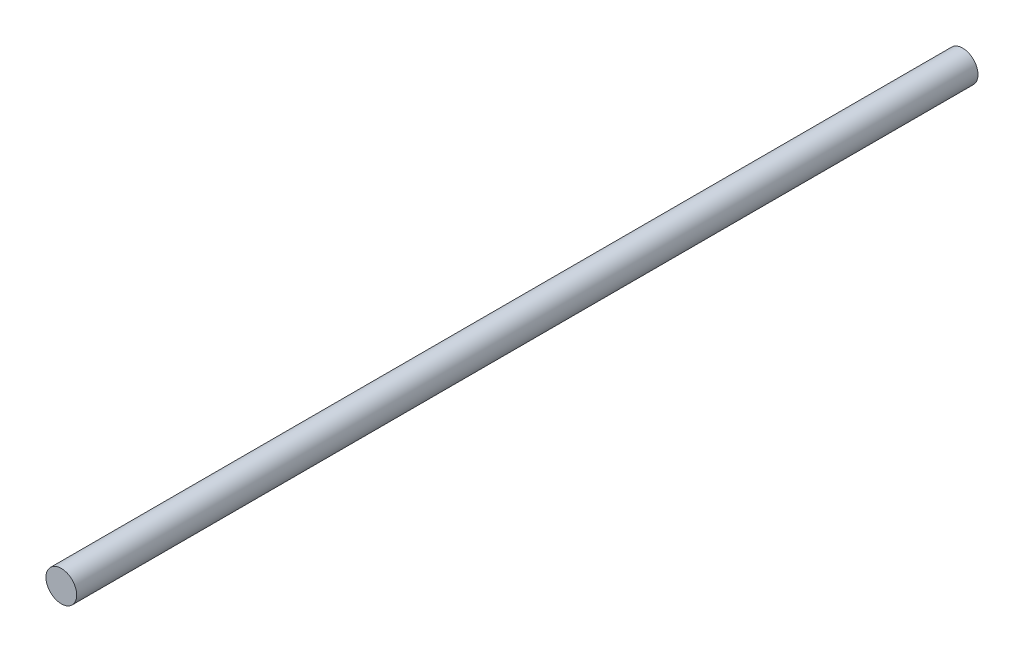
ISO-10303-21;
HEADER;
FILE_DESCRIPTION(('STEP AP214'),'2;1');
FILE_NAME('part.step','',(''),(''),'','','');
FILE_SCHEMA(('AUTOMOTIVE_DESIGN { 1 0 10303 214 1 1 1 1 }'));
ENDSEC;
DATA;
#1=APPLICATION_CONTEXT('core data for automotive mechanical design processes');
#2=APPLICATION_PROTOCOL_DEFINITION('international standard','automotive_design',2000,#1);
#3=PRODUCT_CONTEXT('',#1,'mechanical');
#4=PRODUCT('Part','Part','',(#3));
#5=PRODUCT_RELATED_PRODUCT_CATEGORY('part','',(#4));
#6=PRODUCT_DEFINITION_FORMATION('','',#4);
#7=PRODUCT_DEFINITION_CONTEXT('part definition',#1,'design');
#8=PRODUCT_DEFINITION('design','',#6,#7);
#9=PRODUCT_DEFINITION_SHAPE('','',#8);
#10=(LENGTH_UNIT() NAMED_UNIT(*) SI_UNIT(.MILLI.,.METRE.));
#11=(NAMED_UNIT(*) PLANE_ANGLE_UNIT() SI_UNIT($,.RADIAN.));
#12=(NAMED_UNIT(*) SI_UNIT($,.STERADIAN.) SOLID_ANGLE_UNIT());
#13=UNCERTAINTY_MEASURE_WITH_UNIT(LENGTH_MEASURE(1.E-05),#10,'distance_accuracy_value','');
#14=(GEOMETRIC_REPRESENTATION_CONTEXT(3) GLOBAL_UNCERTAINTY_ASSIGNED_CONTEXT((#13)) GLOBAL_UNIT_ASSIGNED_CONTEXT((#10,
#11,#12)) REPRESENTATION_CONTEXT('',''));
#15=CARTESIAN_POINT('',(0.,0.,0.));
#16=DIRECTION('',(0.,0.,1.));
#17=DIRECTION('',(1.,0.,0.));
#18=AXIS2_PLACEMENT_3D('',#15,#16,#17);
#19=CARTESIAN_POINT('',(0.,0.,88.));
#20=DIRECTION('',(0.,0.,-1.));
#21=DIRECTION('',(-1.,0.,0.));
#22=AXIS2_PLACEMENT_3D('',#19,#20,#21);
#23=CYLINDRICAL_SURFACE('',#22,1.5);
#24=CARTESIAN_POINT('',(0.,0.,88.));
#25=DIRECTION('',(0.,0.,1.));
#26=DIRECTION('',(1.,0.,0.));
#27=AXIS2_PLACEMENT_3D('',#24,#25,#26);
#28=CIRCLE('',#27,1.5);
#29=CARTESIAN_POINT('',(1.5,0.,88.));
#30=VERTEX_POINT('',#29);
#31=EDGE_CURVE('E10',#30,#30,#28,.T.);
#32=ORIENTED_EDGE('',*,*,#31,.F.);
#33=EDGE_LOOP('',(#32));
#34=FACE_BOUND('',#33,.T.);
#35=CARTESIAN_POINT('',(0.,0.,0.));
#36=DIRECTION('',(0.,0.,1.));
#37=DIRECTION('',(1.,0.,0.));
#38=AXIS2_PLACEMENT_3D('',#35,#36,#37);
#39=CIRCLE('',#38,1.5);
#40=CARTESIAN_POINT('',(1.5,0.,0.));
#41=VERTEX_POINT('',#40);
#42=EDGE_CURVE('E40',#41,#41,#39,.T.);
#43=ORIENTED_EDGE('',*,*,#42,.T.);
#44=EDGE_LOOP('',(#43));
#45=FACE_BOUND('',#44,.T.);
#46=ADVANCED_FACE('F37',(#34,#45),#23,.T.);
#47=CARTESIAN_POINT('',(0.,0.,88.));
#48=DIRECTION('',(0.,0.,1.));
#49=DIRECTION('',(1.,0.,0.));
#50=AXIS2_PLACEMENT_3D('',#47,#48,#49);
#51=PLANE('',#50);
#52=ORIENTED_EDGE('',*,*,#31,.T.);
#53=EDGE_LOOP('',(#52));
#54=FACE_BOUND('',#53,.T.);
#55=ADVANCED_FACE('F54',(#54),#51,.T.);
#56=CARTESIAN_POINT('',(0.,0.,0.));
#57=DIRECTION('',(0.,0.,1.));
#58=DIRECTION('',(1.,0.,0.));
#59=AXIS2_PLACEMENT_3D('',#56,#57,#58);
#60=PLANE('',#59);
#61=ORIENTED_EDGE('',*,*,#42,.F.);
#62=EDGE_LOOP('',(#61));
#63=FACE_BOUND('',#62,.T.);
#64=ADVANCED_FACE('F52',(#63),#60,.F.);
#65=CLOSED_SHELL('',(#46,#55,#64));
#66=MANIFOLD_SOLID_BREP('B2',#65);
#67=ADVANCED_BREP_SHAPE_REPRESENTATION('',(#18,#66),#14);
#68=SHAPE_DEFINITION_REPRESENTATION(#9,#67);
ENDSEC;
END-ISO-10303-21;
